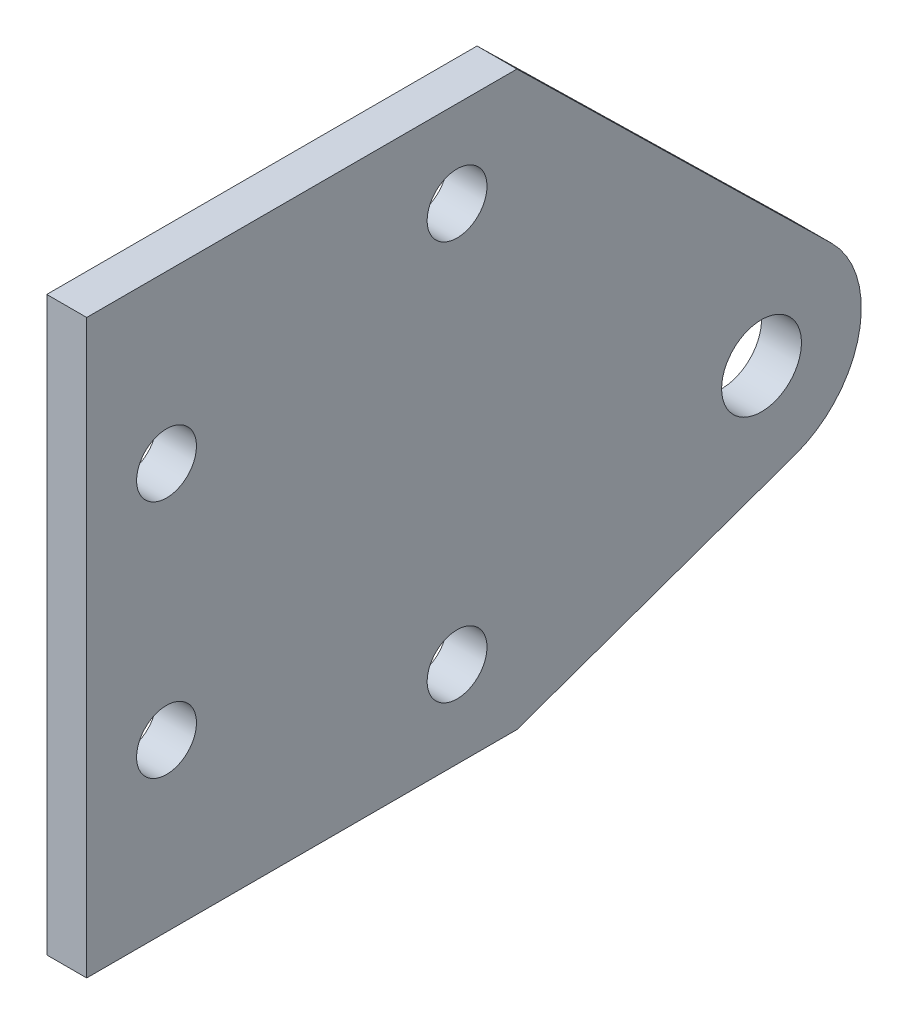
ISO-10303-21;
HEADER;
FILE_DESCRIPTION(('STEP AP214'),'2;1');
FILE_NAME('part.step','',(''),(''),'','','');
FILE_SCHEMA(('AUTOMOTIVE_DESIGN { 1 0 10303 214 1 1 1 1 }'));
ENDSEC;
DATA;
#1=APPLICATION_CONTEXT('core data for automotive mechanical design processes');
#2=APPLICATION_PROTOCOL_DEFINITION('international standard','automotive_design',2000,#1);
#3=PRODUCT_CONTEXT('',#1,'mechanical');
#4=PRODUCT('Part','Part','',(#3));
#5=PRODUCT_RELATED_PRODUCT_CATEGORY('part','',(#4));
#6=PRODUCT_DEFINITION_FORMATION('','',#4);
#7=PRODUCT_DEFINITION_CONTEXT('part definition',#1,'design');
#8=PRODUCT_DEFINITION('design','',#6,#7);
#9=PRODUCT_DEFINITION_SHAPE('','',#8);
#10=(LENGTH_UNIT() NAMED_UNIT(*) SI_UNIT(.MILLI.,.METRE.));
#11=(NAMED_UNIT(*) PLANE_ANGLE_UNIT() SI_UNIT($,.RADIAN.));
#12=(NAMED_UNIT(*) SI_UNIT($,.STERADIAN.) SOLID_ANGLE_UNIT());
#13=UNCERTAINTY_MEASURE_WITH_UNIT(LENGTH_MEASURE(1.E-05),#10,'distance_accuracy_value','');
#14=(GEOMETRIC_REPRESENTATION_CONTEXT(3) GLOBAL_UNCERTAINTY_ASSIGNED_CONTEXT((#13)) GLOBAL_UNIT_ASSIGNED_CONTEXT((#10,
#11,#12)) REPRESENTATION_CONTEXT('',''));
#15=CARTESIAN_POINT('',(0.,0.,0.));
#16=DIRECTION('',(0.,0.,1.));
#17=DIRECTION('',(1.,0.,0.));
#18=AXIS2_PLACEMENT_3D('',#15,#16,#17);
#19=CARTESIAN_POINT('',(-28.5750000000038,268.493082500583,95.4248000965209));
#20=DIRECTION('',(0.,0.942258335635861,0.334886889747475));
#21=DIRECTION('',(0.,-0.334886889747475,0.942258335635861));
#22=AXIS2_PLACEMENT_3D('',#19,#20,#21);
#23=PLANE('',#22);
#24=DIRECTION('',(0.,-0.334886889747475,0.942258335635861));
#25=VECTOR('',#24,1.);
#26=CARTESIAN_POINT('',(-25.4000000000038,268.493082500583,95.4248000965209));
#27=LINE('',#26,#25);
#28=CARTESIAN_POINT('',(-25.4000000000038,341.719008080164,-110.608164687619));
#29=VERTEX_POINT('',#28);
#30=CARTESIAN_POINT('',(-25.4000000000038,333.860683619272,-88.497500000243));
#31=VERTEX_POINT('',#30);
#32=EDGE_CURVE('E135',#29,#31,#27,.T.);
#33=ORIENTED_EDGE('',*,*,#32,.T.);
#34=DIRECTION('',(1.,0.,0.));
#35=VECTOR('',#34,1.);
#36=CARTESIAN_POINT('',(-28.5750000000038,333.860683619272,-88.497500000243));
#37=LINE('',#36,#35);
#38=CARTESIAN_POINT('',(-28.5750000000038,333.860683619272,-88.497500000243));
#39=VERTEX_POINT('',#38);
#40=EDGE_CURVE('E11',#39,#31,#37,.T.);
#41=ORIENTED_EDGE('',*,*,#40,.F.);
#42=DIRECTION('',(0.,-0.334886889747475,0.942258335635861));
#43=VECTOR('',#42,1.);
#44=CARTESIAN_POINT('',(-28.5750000000038,268.493082500583,95.4248000965209));
#45=LINE('',#44,#43);
#46=CARTESIAN_POINT('',(-28.5750000000038,341.719008080164,-110.608164687619));
#47=VERTEX_POINT('',#46);
#48=EDGE_CURVE('E160',#47,#39,#45,.T.);
#49=ORIENTED_EDGE('',*,*,#48,.F.);
#50=DIRECTION('',(1.,0.,0.));
#51=VECTOR('',#50,1.);
#52=CARTESIAN_POINT('',(-28.5750000000038,341.719008080164,-110.608164687619));
#53=LINE('',#52,#51);
#54=EDGE_CURVE('E134',#47,#29,#53,.T.);
#55=ORIENTED_EDGE('',*,*,#54,.T.);
#56=EDGE_LOOP('',(#33,#41,#49,#55));
#57=FACE_BOUND('',#56,.T.);
#58=ADVANCED_FACE('F35',(#57),#23,.F.);
#59=CARTESIAN_POINT('',(-28.5750000000038,333.860683619272,0.));
#60=DIRECTION('',(0.,1.,0.));
#61=DIRECTION('',(0.,0.,1.));
#62=AXIS2_PLACEMENT_3D('',#59,#60,#61);
#63=PLANE('',#62);
#64=DIRECTION('',(0.,0.,1.));
#65=VECTOR('',#64,1.);
#66=CARTESIAN_POINT('',(-25.4000000000038,333.860683619272,0.));
#67=LINE('',#66,#65);
#68=CARTESIAN_POINT('',(-25.4000000000038,333.860683619272,-54.2750000002463));
#69=VERTEX_POINT('',#68);
#70=EDGE_CURVE('E138',#31,#69,#67,.T.);
#71=ORIENTED_EDGE('',*,*,#70,.T.);
#72=DIRECTION('',(1.,0.,0.));
#73=VECTOR('',#72,1.);
#74=CARTESIAN_POINT('',(-28.5750000000038,333.860683619272,-54.2750000002463));
#75=LINE('',#74,#73);
#76=CARTESIAN_POINT('',(-28.5750000000038,333.860683619272,-54.2750000002463));
#77=VERTEX_POINT('',#76);
#78=EDGE_CURVE('E43',#77,#69,#75,.T.);
#79=ORIENTED_EDGE('',*,*,#78,.F.);
#80=DIRECTION('',(0.,0.,1.));
#81=VECTOR('',#80,1.);
#82=CARTESIAN_POINT('',(-28.5750000000038,333.860683619272,0.));
#83=LINE('',#82,#81);
#84=EDGE_CURVE('E88',#39,#77,#83,.T.);
#85=ORIENTED_EDGE('',*,*,#84,.F.);
#86=ORIENTED_EDGE('',*,*,#40,.T.);
#87=EDGE_LOOP('',(#71,#79,#85,#86));
#88=FACE_BOUND('',#87,.T.);
#89=ADVANCED_FACE('F190',(#88),#63,.F.);
#90=CARTESIAN_POINT('',(-28.5750000000038,5.6850044899975E-13,-54.2750000002498));
#91=DIRECTION('',(0.,0.,-1.));
#92=DIRECTION('',(0.,1.,0.));
#93=AXIS2_PLACEMENT_3D('',#90,#91,#92);
#94=PLANE('',#93);
#95=DIRECTION('',(0.,1.,0.));
#96=VECTOR('',#95,1.);
#97=CARTESIAN_POINT('',(-25.4000000000038,5.6850044899975E-13,-54.2750000002498));
#98=LINE('',#97,#96);
#99=CARTESIAN_POINT('',(-25.4000000000038,379.360683619273,-54.2750000002459));
#100=VERTEX_POINT('',#99);
#101=EDGE_CURVE('E140',#69,#100,#98,.T.);
#102=ORIENTED_EDGE('',*,*,#101,.T.);
#103=DIRECTION('',(1.,0.,0.));
#104=VECTOR('',#103,1.);
#105=CARTESIAN_POINT('',(-28.5750000000038,379.360683619273,-54.2750000002459));
#106=LINE('',#105,#104);
#107=CARTESIAN_POINT('',(-28.5750000000038,379.360683619273,-54.2750000002459));
#108=VERTEX_POINT('',#107);
#109=EDGE_CURVE('E111',#108,#100,#106,.T.);
#110=ORIENTED_EDGE('',*,*,#109,.F.);
#111=DIRECTION('',(0.,1.,0.));
#112=VECTOR('',#111,1.);
#113=CARTESIAN_POINT('',(-28.5750000000038,5.6850044899975E-13,-54.2750000002498));
#114=LINE('',#113,#112);
#115=EDGE_CURVE('E102',#77,#108,#114,.T.);
#116=ORIENTED_EDGE('',*,*,#115,.F.);
#117=ORIENTED_EDGE('',*,*,#78,.T.);
#118=EDGE_LOOP('',(#102,#110,#116,#117));
#119=FACE_BOUND('',#118,.T.);
#120=ADVANCED_FACE('F166',(#119),#94,.F.);
#121=CARTESIAN_POINT('',(-28.5750000000038,379.360683619272,4.1755525753253E-12));
#122=DIRECTION('',(0.,-1.,0.));
#123=DIRECTION('',(0.,0.,-1.));
#124=AXIS2_PLACEMENT_3D('',#121,#122,#123);
#125=PLANE('',#124);
#126=DIRECTION('',(0.,0.,-1.));
#127=VECTOR('',#126,1.);
#128=CARTESIAN_POINT('',(-25.4000000000038,379.360683619272,4.1755525753253E-12));
#129=LINE('',#128,#127);
#130=CARTESIAN_POINT('',(-25.4000000000038,379.360683619273,-88.4975000002426));
#131=VERTEX_POINT('',#130);
#132=EDGE_CURVE('E110',#100,#131,#129,.T.);
#133=ORIENTED_EDGE('',*,*,#132,.T.);
#134=DIRECTION('',(1.,0.,0.));
#135=VECTOR('',#134,1.);
#136=CARTESIAN_POINT('',(-28.5750000000038,379.360683619273,-88.4975000002426));
#137=LINE('',#136,#135);
#138=CARTESIAN_POINT('',(-28.5750000000038,379.360683619273,-88.4975000002426));
#139=VERTEX_POINT('',#138);
#140=EDGE_CURVE('E107',#139,#131,#137,.T.);
#141=ORIENTED_EDGE('',*,*,#140,.F.);
#142=DIRECTION('',(0.,0.,-1.));
#143=VECTOR('',#142,1.);
#144=CARTESIAN_POINT('',(-28.5750000000038,379.360683619272,4.1755525753253E-12));
#145=LINE('',#144,#143);
#146=EDGE_CURVE('E95',#108,#139,#145,.T.);
#147=ORIENTED_EDGE('',*,*,#146,.F.);
#148=ORIENTED_EDGE('',*,*,#109,.T.);
#149=EDGE_LOOP('',(#133,#141,#147,#148));
#150=FACE_BOUND('',#149,.T.);
#151=ADVANCED_FACE('F108',(#150),#125,.F.);
#152=CARTESIAN_POINT('',(-28.5750000000038,237.863920821237,-232.967924063665));
#153=DIRECTION('',(0.,-0.714421084351475,0.699716023994065));
#154=DIRECTION('',(0.,-0.699716023994065,-0.714421084351475));
#155=AXIS2_PLACEMENT_3D('',#152,#153,#154);
#156=PLANE('',#155);
#157=DIRECTION('',(0.,-0.699716023994065,-0.714421084351475));
#158=VECTOR('',#157,1.);
#159=CARTESIAN_POINT('',(-25.4000000000038,237.863920821237,-232.967924063665));
#160=LINE('',#159,#158);
#161=CARTESIAN_POINT('',(-25.4000000000038,354.868900976314,-113.503995940701));
#162=VERTEX_POINT('',#161);
#163=EDGE_CURVE('E74',#131,#162,#160,.T.);
#164=ORIENTED_EDGE('',*,*,#163,.T.);
#165=DIRECTION('',(1.,0.,0.));
#166=VECTOR('',#165,1.);
#167=CARTESIAN_POINT('',(-28.5750000000038,354.868900976314,-113.503995940701));
#168=LINE('',#167,#166);
#169=CARTESIAN_POINT('',(-28.5750000000038,354.868900976314,-113.503995940701));
#170=VERTEX_POINT('',#169);
#171=EDGE_CURVE('E112',#170,#162,#168,.T.);
#172=ORIENTED_EDGE('',*,*,#171,.F.);
#173=DIRECTION('',(0.,-0.699716023994065,-0.714421084351475));
#174=VECTOR('',#173,1.);
#175=CARTESIAN_POINT('',(-28.5750000000038,237.863920821237,-232.967924063665));
#176=LINE('',#175,#174);
#177=EDGE_CURVE('E100',#139,#170,#176,.T.);
#178=ORIENTED_EDGE('',*,*,#177,.F.);
#179=ORIENTED_EDGE('',*,*,#140,.T.);
#180=EDGE_LOOP('',(#164,#172,#178,#179));
#181=FACE_BOUND('',#180,.T.);
#182=ADVANCED_FACE('F114',(#181),#156,.F.);
#183=CARTESIAN_POINT('',(-28.5750000000038,366.135683619273,-60.6250000002458));
#184=DIRECTION('',(1.,0.,0.));
#185=DIRECTION('',(0.,0.,-1.));
#186=AXIS2_PLACEMENT_3D('',#183,#184,#185);
#187=CYLINDRICAL_SURFACE('',#186,2.38125000000307);
#188=CARTESIAN_POINT('',(-28.5750000000038,366.135683619273,-60.6250000002458));
#189=DIRECTION('',(-1.,0.,0.));
#190=DIRECTION('',(0.,0.,1.));
#191=AXIS2_PLACEMENT_3D('',#188,#189,#190);
#192=CIRCLE('',#191,2.38125000000307);
#193=CARTESIAN_POINT('',(-28.5750000000038,366.135683619273,-58.2437500002428));
#194=VERTEX_POINT('',#193);
#195=EDGE_CURVE('E128',#194,#194,#192,.T.);
#196=ORIENTED_EDGE('',*,*,#195,.T.);
#197=EDGE_LOOP('',(#196));
#198=FACE_BOUND('',#197,.T.);
#199=CARTESIAN_POINT('',(-25.4000000000038,366.135683619273,-60.6250000002458));
#200=DIRECTION('',(-1.,0.,0.));
#201=DIRECTION('',(0.,0.,1.));
#202=AXIS2_PLACEMENT_3D('',#199,#200,#201);
#203=CIRCLE('',#202,2.38125000000307);
#204=CARTESIAN_POINT('',(-25.4000000000038,366.135683619273,-58.2437500002428));
#205=VERTEX_POINT('',#204);
#206=EDGE_CURVE('E154',#205,#205,#203,.T.);
#207=ORIENTED_EDGE('',*,*,#206,.F.);
#208=EDGE_LOOP('',(#207));
#209=FACE_BOUND('',#208,.T.);
#210=ADVANCED_FACE('F201',(#198,#209),#187,.F.);
#211=CARTESIAN_POINT('',(-28.5750000000038,372.485683619273,-83.7350000002471));
#212=DIRECTION('',(1.,0.,0.));
#213=DIRECTION('',(0.,0.,-1.));
#214=AXIS2_PLACEMENT_3D('',#211,#212,#213);
#215=CYLINDRICAL_SURFACE('',#214,2.38125000019646);
#216=CARTESIAN_POINT('',(-28.5750000000038,372.485683619273,-83.7350000002471));
#217=DIRECTION('',(-1.,0.,0.));
#218=DIRECTION('',(0.,0.,1.));
#219=AXIS2_PLACEMENT_3D('',#216,#217,#218);
#220=CIRCLE('',#219,2.38125000019646);
#221=CARTESIAN_POINT('',(-28.5750000000038,372.485683619273,-81.3537500000507));
#222=VERTEX_POINT('',#221);
#223=EDGE_CURVE('E125',#222,#222,#220,.T.);
#224=ORIENTED_EDGE('',*,*,#223,.T.);
#225=EDGE_LOOP('',(#224));
#226=FACE_BOUND('',#225,.T.);
#227=CARTESIAN_POINT('',(-25.4000000000038,372.485683619273,-83.7350000002471));
#228=DIRECTION('',(-1.,0.,0.));
#229=DIRECTION('',(0.,0.,1.));
#230=AXIS2_PLACEMENT_3D('',#227,#228,#229);
#231=CIRCLE('',#230,2.38125000019646);
#232=CARTESIAN_POINT('',(-25.4000000000038,372.485683619273,-81.3537500000507));
#233=VERTEX_POINT('',#232);
#234=EDGE_CURVE('E151',#233,#233,#231,.T.);
#235=ORIENTED_EDGE('',*,*,#234,.F.);
#236=EDGE_LOOP('',(#235));
#237=FACE_BOUND('',#236,.T.);
#238=ADVANCED_FACE('F205',(#226,#237),#215,.F.);
#239=CARTESIAN_POINT('',(-28.5750000000038,347.085683619273,-60.6250000002458));
#240=DIRECTION('',(1.,0.,0.));
#241=DIRECTION('',(0.,0.,-1.));
#242=AXIS2_PLACEMENT_3D('',#239,#240,#241);
#243=CYLINDRICAL_SURFACE('',#242,2.38125000000307);
#244=CARTESIAN_POINT('',(-28.5750000000038,347.085683619273,-60.6250000002458));
#245=DIRECTION('',(-1.,0.,0.));
#246=DIRECTION('',(0.,0.,1.));
#247=AXIS2_PLACEMENT_3D('',#244,#245,#246);
#248=CIRCLE('',#247,2.38125000000307);
#249=CARTESIAN_POINT('',(-28.5750000000038,347.085683619273,-58.2437500002428));
#250=VERTEX_POINT('',#249);
#251=EDGE_CURVE('E122',#250,#250,#248,.T.);
#252=ORIENTED_EDGE('',*,*,#251,.T.);
#253=EDGE_LOOP('',(#252));
#254=FACE_BOUND('',#253,.T.);
#255=CARTESIAN_POINT('',(-25.4000000000038,347.085683619273,-60.6250000002458));
#256=DIRECTION('',(-1.,0.,0.));
#257=DIRECTION('',(0.,0.,1.));
#258=AXIS2_PLACEMENT_3D('',#255,#256,#257);
#259=CIRCLE('',#258,2.38125000000307);
#260=CARTESIAN_POINT('',(-25.4000000000038,347.085683619273,-58.2437500002428));
#261=VERTEX_POINT('',#260);
#262=EDGE_CURVE('E148',#261,#261,#259,.T.);
#263=ORIENTED_EDGE('',*,*,#262,.F.);
#264=EDGE_LOOP('',(#263));
#265=FACE_BOUND('',#264,.T.);
#266=ADVANCED_FACE('F185',(#254,#265),#243,.F.);
#267=CARTESIAN_POINT('',(-28.5750000000038,349.198183619274,-107.950000000248));
#268=DIRECTION('',(1.,0.,0.));
#269=DIRECTION('',(0.,0.,-1.));
#270=AXIS2_PLACEMENT_3D('',#267,#268,#269);
#271=CYLINDRICAL_SURFACE('',#270,3.175);
#272=CARTESIAN_POINT('',(-28.5750000000038,349.198183619274,-107.950000000248));
#273=DIRECTION('',(-1.,0.,0.));
#274=DIRECTION('',(0.,0.,1.));
#275=AXIS2_PLACEMENT_3D('',#272,#273,#274);
#276=CIRCLE('',#275,3.175);
#277=CARTESIAN_POINT('',(-28.5750000000038,349.198183619274,-104.775000000248));
#278=VERTEX_POINT('',#277);
#279=EDGE_CURVE('E116',#278,#278,#276,.T.);
#280=ORIENTED_EDGE('',*,*,#279,.T.);
#281=EDGE_LOOP('',(#280));
#282=FACE_BOUND('',#281,.T.);
#283=CARTESIAN_POINT('',(-25.4000000000038,349.198183619274,-107.950000000248));
#284=DIRECTION('',(-1.,0.,0.));
#285=DIRECTION('',(0.,0.,1.));
#286=AXIS2_PLACEMENT_3D('',#283,#284,#285);
#287=CIRCLE('',#286,3.175);
#288=CARTESIAN_POINT('',(-25.4000000000038,349.198183619274,-104.775000000248));
#289=VERTEX_POINT('',#288);
#290=EDGE_CURVE('E145',#289,#289,#287,.T.);
#291=ORIENTED_EDGE('',*,*,#290,.F.);
#292=EDGE_LOOP('',(#291));
#293=FACE_BOUND('',#292,.T.);
#294=ADVANCED_FACE('F177',(#282,#293),#271,.F.);
#295=CARTESIAN_POINT('',(-28.5750000000038,349.198183619274,-107.950000000248));
#296=DIRECTION('',(1.,0.,0.));
#297=DIRECTION('',(0.,0.,-1.));
#298=AXIS2_PLACEMENT_3D('',#295,#296,#297);
#299=CYLINDRICAL_SURFACE('',#298,7.9375);
#300=CARTESIAN_POINT('',(-25.4000000000038,349.198183619274,-107.950000000248));
#301=DIRECTION('',(-1.,0.,0.));
#302=DIRECTION('',(0.,0.,1.));
#303=AXIS2_PLACEMENT_3D('',#300,#301,#302);
#304=CIRCLE('',#303,7.9375);
#305=EDGE_CURVE('E80',#162,#29,#304,.T.);
#306=ORIENTED_EDGE('',*,*,#305,.T.);
#307=ORIENTED_EDGE('',*,*,#54,.F.);
#308=CARTESIAN_POINT('',(-28.5750000000038,349.198183619274,-107.950000000248));
#309=DIRECTION('',(-1.,0.,0.));
#310=DIRECTION('',(0.,0.,1.));
#311=AXIS2_PLACEMENT_3D('',#308,#309,#310);
#312=CIRCLE('',#311,7.9375);
#313=EDGE_CURVE('E51',#170,#47,#312,.T.);
#314=ORIENTED_EDGE('',*,*,#313,.F.);
#315=ORIENTED_EDGE('',*,*,#171,.T.);
#316=EDGE_LOOP('',(#306,#307,#314,#315));
#317=FACE_BOUND('',#316,.T.);
#318=ADVANCED_FACE('F174',(#317),#299,.T.);
#319=CARTESIAN_POINT('',(-28.5750000000038,340.735683619273,-83.7350000002471));
#320=DIRECTION('',(1.,0.,0.));
#321=DIRECTION('',(0.,0.,-1.));
#322=AXIS2_PLACEMENT_3D('',#319,#320,#321);
#323=CYLINDRICAL_SURFACE('',#322,2.38125000019646);
#324=CARTESIAN_POINT('',(-28.5750000000038,340.735683619273,-83.7350000002471));
#325=DIRECTION('',(-1.,0.,0.));
#326=DIRECTION('',(0.,0.,1.));
#327=AXIS2_PLACEMENT_3D('',#324,#325,#326);
#328=CIRCLE('',#327,2.38125000019646);
#329=CARTESIAN_POINT('',(-28.5750000000038,340.735683619273,-81.3537500000507));
#330=VERTEX_POINT('',#329);
#331=EDGE_CURVE('E131',#330,#330,#328,.T.);
#332=ORIENTED_EDGE('',*,*,#331,.T.);
#333=EDGE_LOOP('',(#332));
#334=FACE_BOUND('',#333,.T.);
#335=CARTESIAN_POINT('',(-25.4000000000038,340.735683619273,-83.7350000002471));
#336=DIRECTION('',(-1.,0.,0.));
#337=DIRECTION('',(0.,0.,1.));
#338=AXIS2_PLACEMENT_3D('',#335,#336,#337);
#339=CIRCLE('',#338,2.38125000019646);
#340=CARTESIAN_POINT('',(-25.4000000000038,340.735683619273,-81.3537500000507));
#341=VERTEX_POINT('',#340);
#342=EDGE_CURVE('E157',#341,#341,#339,.T.);
#343=ORIENTED_EDGE('',*,*,#342,.F.);
#344=EDGE_LOOP('',(#343));
#345=FACE_BOUND('',#344,.T.);
#346=ADVANCED_FACE('F176',(#334,#345),#323,.F.);
#347=CARTESIAN_POINT('',(-28.5750000000038,0.,0.));
#348=DIRECTION('',(-1.,0.,0.));
#349=DIRECTION('',(0.,0.,1.));
#350=AXIS2_PLACEMENT_3D('',#347,#348,#349);
#351=PLANE('',#350);
#352=ORIENTED_EDGE('',*,*,#48,.T.);
#353=ORIENTED_EDGE('',*,*,#84,.T.);
#354=ORIENTED_EDGE('',*,*,#115,.T.);
#355=ORIENTED_EDGE('',*,*,#146,.T.);
#356=ORIENTED_EDGE('',*,*,#177,.T.);
#357=ORIENTED_EDGE('',*,*,#313,.T.);
#358=EDGE_LOOP('',(#352,#353,#354,#355,#356,#357));
#359=FACE_BOUND('',#358,.T.);
#360=ORIENTED_EDGE('',*,*,#279,.F.);
#361=EDGE_LOOP('',(#360));
#362=FACE_BOUND('',#361,.T.);
#363=ORIENTED_EDGE('',*,*,#251,.F.);
#364=EDGE_LOOP('',(#363));
#365=FACE_BOUND('',#364,.T.);
#366=ORIENTED_EDGE('',*,*,#223,.F.);
#367=EDGE_LOOP('',(#366));
#368=FACE_BOUND('',#367,.T.);
#369=ORIENTED_EDGE('',*,*,#195,.F.);
#370=EDGE_LOOP('',(#369));
#371=FACE_BOUND('',#370,.T.);
#372=ORIENTED_EDGE('',*,*,#331,.F.);
#373=EDGE_LOOP('',(#372));
#374=FACE_BOUND('',#373,.T.);
#375=ADVANCED_FACE('F97',(#359,#362,#365,#368,#371,#374),#351,.T.);
#376=CARTESIAN_POINT('',(-25.4000000000038,0.,0.));
#377=DIRECTION('',(-1.,0.,0.));
#378=DIRECTION('',(0.,0.,1.));
#379=AXIS2_PLACEMENT_3D('',#376,#377,#378);
#380=PLANE('',#379);
#381=ORIENTED_EDGE('',*,*,#32,.F.);
#382=ORIENTED_EDGE('',*,*,#305,.F.);
#383=ORIENTED_EDGE('',*,*,#163,.F.);
#384=ORIENTED_EDGE('',*,*,#132,.F.);
#385=ORIENTED_EDGE('',*,*,#101,.F.);
#386=ORIENTED_EDGE('',*,*,#70,.F.);
#387=EDGE_LOOP('',(#381,#382,#383,#384,#385,#386));
#388=FACE_BOUND('',#387,.T.);
#389=ORIENTED_EDGE('',*,*,#290,.T.);
#390=EDGE_LOOP('',(#389));
#391=FACE_BOUND('',#390,.T.);
#392=ORIENTED_EDGE('',*,*,#262,.T.);
#393=EDGE_LOOP('',(#392));
#394=FACE_BOUND('',#393,.T.);
#395=ORIENTED_EDGE('',*,*,#234,.T.);
#396=EDGE_LOOP('',(#395));
#397=FACE_BOUND('',#396,.T.);
#398=ORIENTED_EDGE('',*,*,#206,.T.);
#399=EDGE_LOOP('',(#398));
#400=FACE_BOUND('',#399,.T.);
#401=ORIENTED_EDGE('',*,*,#342,.T.);
#402=EDGE_LOOP('',(#401));
#403=FACE_BOUND('',#402,.T.);
#404=ADVANCED_FACE('F169',(#388,#391,#394,#397,#400,#403),#380,.F.);
#405=CLOSED_SHELL('',(#58,#89,#120,#151,#182,#210,#238,#266,#294,#318,#346,#375,#404));
#406=MANIFOLD_SOLID_BREP('B2',#405);
#407=ADVANCED_BREP_SHAPE_REPRESENTATION('',(#18,#406),#14);
#408=SHAPE_DEFINITION_REPRESENTATION(#9,#407);
ENDSEC;
END-ISO-10303-21;
